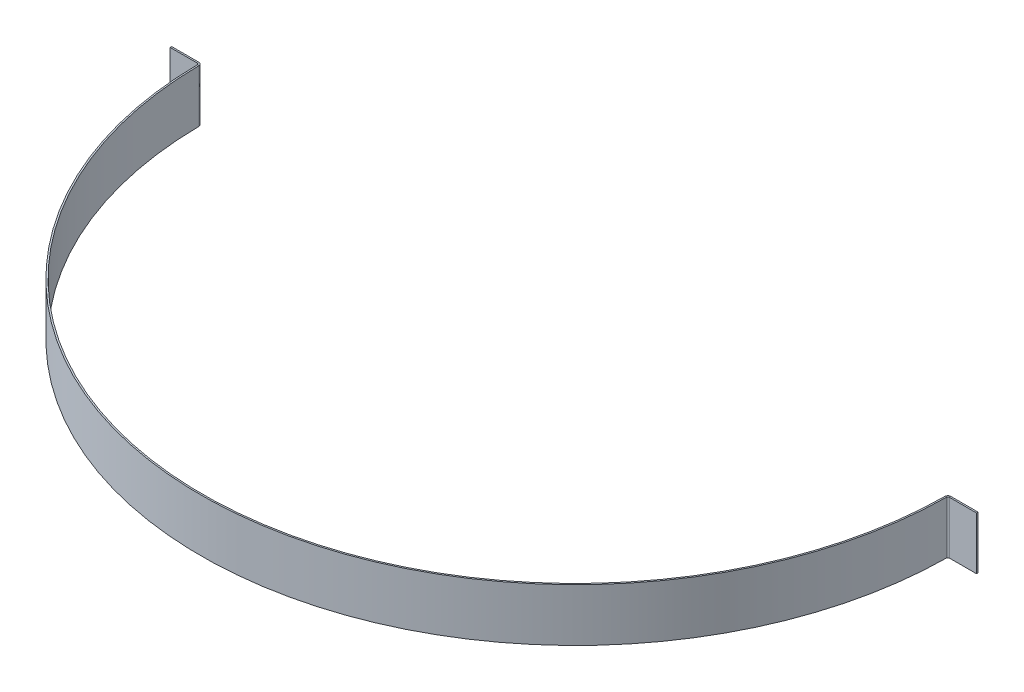
ISO-10303-21;
HEADER;
FILE_DESCRIPTION(('STEP AP214'),'2;1');
FILE_NAME('part.step','',(''),(''),'','','');
FILE_SCHEMA(('AUTOMOTIVE_DESIGN { 1 0 10303 214 1 1 1 1 }'));
ENDSEC;
DATA;
#1=APPLICATION_CONTEXT('core data for automotive mechanical design processes');
#2=APPLICATION_PROTOCOL_DEFINITION('international standard','automotive_design',2000,#1);
#3=PRODUCT_CONTEXT('',#1,'mechanical');
#4=PRODUCT('Part','Part','',(#3));
#5=PRODUCT_RELATED_PRODUCT_CATEGORY('part','',(#4));
#6=PRODUCT_DEFINITION_FORMATION('','',#4);
#7=PRODUCT_DEFINITION_CONTEXT('part definition',#1,'design');
#8=PRODUCT_DEFINITION('design','',#6,#7);
#9=PRODUCT_DEFINITION_SHAPE('','',#8);
#10=(LENGTH_UNIT() NAMED_UNIT(*) SI_UNIT(.MILLI.,.METRE.));
#11=(NAMED_UNIT(*) PLANE_ANGLE_UNIT() SI_UNIT($,.RADIAN.));
#12=(NAMED_UNIT(*) SI_UNIT($,.STERADIAN.) SOLID_ANGLE_UNIT());
#13=UNCERTAINTY_MEASURE_WITH_UNIT(LENGTH_MEASURE(1.E-05),#10,'distance_accuracy_value','');
#14=(GEOMETRIC_REPRESENTATION_CONTEXT(3) GLOBAL_UNCERTAINTY_ASSIGNED_CONTEXT((#13)) GLOBAL_UNIT_ASSIGNED_CONTEXT((#10,
#11,#12)) REPRESENTATION_CONTEXT('',''));
#15=CARTESIAN_POINT('',(0.,0.,0.));
#16=DIRECTION('',(0.,0.,1.));
#17=DIRECTION('',(1.,0.,0.));
#18=AXIS2_PLACEMENT_3D('',#15,#16,#17);
#19=CARTESIAN_POINT('',(-1.33226762955019E-12,140.,-4.44089209850063E-13));
#20=DIRECTION('',(0.,-1.,0.));
#21=DIRECTION('',(-0.999949948709909,0.,-0.010005002501251));
#22=AXIS2_PLACEMENT_3D('',#19,#20,#21);
#23=PLANE('',#22);
#24=DIRECTION('',(-0.99994994870991,0.,0.0100050025011472));
#25=VECTOR('',#24,1.);
#26=CARTESIAN_POINT('',(-991.450374145877,140.,9.91995997998818));
#27=LINE('',#26,#25);
#28=CARTESIAN_POINT('',(-991.450374145877,140.,9.91995997998818));
#29=VERTEX_POINT('',#28);
#30=CARTESIAN_POINT('',(-995.450173940718,140.,9.95997998998977));
#31=VERTEX_POINT('',#30);
#32=EDGE_CURVE('E11',#29,#31,#27,.T.);
#33=ORIENTED_EDGE('',*,*,#32,.T.);
#34=CARTESIAN_POINT('',(-1.33226762955019E-12,140.,-4.44089209850063E-13));
#35=DIRECTION('',(0.,1.,0.));
#36=DIRECTION('',(0.999949948709909,0.,0.010005002501251));
#37=AXIS2_PLACEMENT_3D('',#34,#35,#36);
#38=CIRCLE('',#37,995.5);
#39=CARTESIAN_POINT('',(995.450173940715,140.,9.9599799899957));
#40=VERTEX_POINT('',#39);
#41=EDGE_CURVE('E189',#31,#40,#38,.T.);
#42=ORIENTED_EDGE('',*,*,#41,.T.);
#43=DIRECTION('',(-0.999949948709909,0.,-0.0100050025012509));
#44=VECTOR('',#43,1.);
#45=CARTESIAN_POINT('',(995.450173940713,140.,9.95997998999354));
#46=LINE('',#45,#44);
#47=CARTESIAN_POINT('',(991.450374145875,140.,9.91995997999251));
#48=VERTEX_POINT('',#47);
#49=EDGE_CURVE('E232',#40,#48,#46,.T.);
#50=ORIENTED_EDGE('',*,*,#49,.T.);
#51=CARTESIAN_POINT('',(-1.33226762955019E-12,140.,-4.44089209850063E-13));
#52=DIRECTION('',(0.,1.,0.));
#53=DIRECTION('',(0.999949948709909,0.,0.010005002501251));
#54=AXIS2_PLACEMENT_3D('',#51,#52,#53);
#55=CIRCLE('',#54,991.5);
#56=EDGE_CURVE('E218',#29,#48,#55,.T.);
#57=ORIENTED_EDGE('',*,*,#56,.F.);
#58=EDGE_LOOP('',(#33,#42,#50,#57));
#59=FACE_BOUND('',#58,.T.);
#60=ADVANCED_FACE('F36',(#59),#23,.F.);
#61=CARTESIAN_POINT('',(-1.33226762955019E-12,0.,-4.44089209850063E-13));
#62=DIRECTION('',(0.,1.,0.));
#63=DIRECTION('',(0.999949948709909,0.,0.010005002501251));
#64=AXIS2_PLACEMENT_3D('',#61,#62,#63);
#65=PLANE('',#64);
#66=DIRECTION('',(0.999949948709909,0.,0.0100050025012509));
#67=VECTOR('',#66,1.);
#68=CARTESIAN_POINT('',(991.450374145874,0.,9.91995997998851));
#69=LINE('',#68,#67);
#70=CARTESIAN_POINT('',(991.450374145875,0.,9.91995997999007));
#71=VERTEX_POINT('',#70);
#72=CARTESIAN_POINT('',(995.450173940713,0.,9.95997998999354));
#73=VERTEX_POINT('',#72);
#74=EDGE_CURVE('E236',#71,#73,#69,.T.);
#75=ORIENTED_EDGE('',*,*,#74,.T.);
#76=CARTESIAN_POINT('',(-1.33226762955019E-12,0.,-4.44089209850063E-13));
#77=DIRECTION('',(0.,1.,0.));
#78=DIRECTION('',(0.999949948709909,0.,0.010005002501251));
#79=AXIS2_PLACEMENT_3D('',#76,#77,#78);
#80=CIRCLE('',#79,995.5);
#81=CARTESIAN_POINT('',(-995.450173940717,0.,9.95997998999345));
#82=VERTEX_POINT('',#81);
#83=EDGE_CURVE('E222',#73,#82,#80,.F.);
#84=ORIENTED_EDGE('',*,*,#83,.T.);
#85=DIRECTION('',(0.99994994870991,0.,-0.0100050025011472));
#86=VECTOR('',#85,1.);
#87=CARTESIAN_POINT('',(-995.450173940717,0.,9.95997998999243));
#88=LINE('',#87,#86);
#89=CARTESIAN_POINT('',(-991.450374145877,0.,9.91995997998924));
#90=VERTEX_POINT('',#89);
#91=EDGE_CURVE('E241',#82,#90,#88,.T.);
#92=ORIENTED_EDGE('',*,*,#91,.T.);
#93=CARTESIAN_POINT('',(-1.33226762955019E-12,0.,-4.44089209850063E-13));
#94=DIRECTION('',(0.,-1.,0.));
#95=DIRECTION('',(-0.999949948709909,0.,-0.010005002501251));
#96=AXIS2_PLACEMENT_3D('',#93,#94,#95);
#97=CIRCLE('',#96,991.5);
#98=EDGE_CURVE('E221',#71,#90,#97,.T.);
#99=ORIENTED_EDGE('',*,*,#98,.F.);
#100=EDGE_LOOP('',(#75,#84,#92,#99));
#101=FACE_BOUND('',#100,.T.);
#102=ADVANCED_FACE('F253',(#101),#65,.F.);
#103=CARTESIAN_POINT('',(-1.33226762955019E-12,-3031.62520563376,-4.44089209850063E-13));
#104=DIRECTION('',(0.,1.,0.));
#105=DIRECTION('',(0.999949948709909,0.,0.010005002501251));
#106=AXIS2_PLACEMENT_3D('',#103,#104,#105);
#107=CYLINDRICAL_SURFACE('',#106,991.5);
#108=ORIENTED_EDGE('',*,*,#98,.T.);
#109=DIRECTION('',(0.,-1.,0.));
#110=VECTOR('',#109,1.);
#111=CARTESIAN_POINT('',(-991.450374145877,140.,9.91995997998818));
#112=LINE('',#111,#110);
#113=EDGE_CURVE('E239',#29,#90,#112,.T.);
#114=ORIENTED_EDGE('',*,*,#113,.F.);
#115=ORIENTED_EDGE('',*,*,#56,.T.);
#116=DIRECTION('',(0.,-1.,0.));
#117=VECTOR('',#116,1.);
#118=CARTESIAN_POINT('',(991.450374145874,140.,9.91995997998851));
#119=LINE('',#118,#117);
#120=EDGE_CURVE('E225',#48,#71,#119,.T.);
#121=ORIENTED_EDGE('',*,*,#120,.T.);
#122=EDGE_LOOP('',(#108,#114,#115,#121));
#123=FACE_BOUND('',#122,.T.);
#124=ADVANCED_FACE('F264',(#123),#107,.F.);
#125=CARTESIAN_POINT('',(-1.33226762955019E-12,-3031.62520563376,-4.44089209850063E-13));
#126=DIRECTION('',(0.,1.,0.));
#127=DIRECTION('',(0.999949948709909,0.,0.010005002501251));
#128=AXIS2_PLACEMENT_3D('',#125,#126,#127);
#129=CYLINDRICAL_SURFACE('',#128,995.5);
#130=ORIENTED_EDGE('',*,*,#83,.F.);
#131=DIRECTION('',(0.,-1.,0.));
#132=VECTOR('',#131,1.);
#133=CARTESIAN_POINT('',(995.450173940713,140.,9.95997998999354));
#134=LINE('',#133,#132);
#135=EDGE_CURVE('E58',#40,#73,#134,.T.);
#136=ORIENTED_EDGE('',*,*,#135,.F.);
#137=ORIENTED_EDGE('',*,*,#41,.F.);
#138=DIRECTION('',(0.,-1.,0.));
#139=VECTOR('',#138,1.);
#140=CARTESIAN_POINT('',(-995.450173940717,140.,9.95997998999243));
#141=LINE('',#140,#139);
#142=EDGE_CURVE('E43',#31,#82,#141,.T.);
#143=ORIENTED_EDGE('',*,*,#142,.T.);
#144=EDGE_LOOP('',(#130,#136,#137,#143));
#145=FACE_BOUND('',#144,.T.);
#146=ADVANCED_FACE('F247',(#145),#129,.T.);
#147=CARTESIAN_POINT('',(1071.5,140.,2.));
#148=DIRECTION('',(1.,0.,0.));
#149=DIRECTION('',(0.,0.,-1.));
#150=AXIS2_PLACEMENT_3D('',#147,#148,#149);
#151=PLANE('',#150);
#152=DIRECTION('',(0.,0.,1.));
#153=VECTOR('',#152,1.);
#154=CARTESIAN_POINT('',(1071.5,0.,2.));
#155=LINE('',#154,#153);
#156=CARTESIAN_POINT('',(1071.5,0.,2.));
#157=VERTEX_POINT('',#156);
#158=CARTESIAN_POINT('',(1071.5,0.,6.));
#159=VERTEX_POINT('',#158);
#160=EDGE_CURVE('E186',#157,#159,#155,.T.);
#161=ORIENTED_EDGE('',*,*,#160,.F.);
#162=DIRECTION('',(0.,-1.,0.));
#163=VECTOR('',#162,1.);
#164=CARTESIAN_POINT('',(1071.5,140.,2.));
#165=LINE('',#164,#163);
#166=CARTESIAN_POINT('',(1071.5,140.,2.));
#167=VERTEX_POINT('',#166);
#168=EDGE_CURVE('E207',#167,#157,#165,.T.);
#169=ORIENTED_EDGE('',*,*,#168,.F.);
#170=DIRECTION('',(0.,0.,1.));
#171=VECTOR('',#170,1.);
#172=CARTESIAN_POINT('',(1071.5,140.,2.));
#173=LINE('',#172,#171);
#174=CARTESIAN_POINT('',(1071.5,140.,6.));
#175=VERTEX_POINT('',#174);
#176=EDGE_CURVE('E214',#167,#175,#173,.T.);
#177=ORIENTED_EDGE('',*,*,#176,.T.);
#178=DIRECTION('',(0.,-1.,0.));
#179=VECTOR('',#178,1.);
#180=CARTESIAN_POINT('',(1071.5,140.,6.));
#181=LINE('',#180,#179);
#182=EDGE_CURVE('E212',#175,#159,#181,.T.);
#183=ORIENTED_EDGE('',*,*,#182,.T.);
#184=EDGE_LOOP('',(#161,#169,#177,#183));
#185=FACE_BOUND('',#184,.T.);
#186=ADVANCED_FACE('F287',(#185),#151,.T.);
#187=CARTESIAN_POINT('',(991.497982852209,140.,2.00000000000012));
#188=DIRECTION('',(0.,0.,-1.));
#189=DIRECTION('',(-1.,0.,0.));
#190=AXIS2_PLACEMENT_3D('',#187,#188,#189);
#191=PLANE('',#190);
#192=DIRECTION('',(1.,0.,0.));
#193=VECTOR('',#192,1.);
#194=CARTESIAN_POINT('',(991.497982852209,0.,2.00000000000012));
#195=LINE('',#194,#193);
#196=CARTESIAN_POINT('',(999.449973735554,0.,2.00000000000011));
#197=VERTEX_POINT('',#196);
#198=EDGE_CURVE('E190',#197,#157,#195,.T.);
#199=ORIENTED_EDGE('',*,*,#198,.F.);
#200=DIRECTION('',(0.,-1.,0.));
#201=VECTOR('',#200,1.);
#202=CARTESIAN_POINT('',(999.449973735554,140.,2.00000000000011));
#203=LINE('',#202,#201);
#204=CARTESIAN_POINT('',(999.449973735554,140.,2.00000000000009));
#205=VERTEX_POINT('',#204);
#206=EDGE_CURVE('E183',#205,#197,#203,.T.);
#207=ORIENTED_EDGE('',*,*,#206,.F.);
#208=DIRECTION('',(1.,0.,0.));
#209=VECTOR('',#208,1.);
#210=CARTESIAN_POINT('',(991.497982852209,140.,2.00000000000012));
#211=LINE('',#210,#209);
#212=EDGE_CURVE('E209',#205,#167,#211,.T.);
#213=ORIENTED_EDGE('',*,*,#212,.T.);
#214=ORIENTED_EDGE('',*,*,#168,.T.);
#215=EDGE_LOOP('',(#199,#207,#213,#214));
#216=FACE_BOUND('',#215,.T.);
#217=ADVANCED_FACE('F282',(#216),#191,.T.);
#218=CARTESIAN_POINT('',(995.450173940715,140.,9.95997998999511));
#219=DIRECTION('',(0.,1.,0.));
#220=DIRECTION('',(0.,0.,1.));
#221=AXIS2_PLACEMENT_3D('',#218,#219,#220);
#222=PLANE('',#221);
#223=ORIENTED_EDGE('',*,*,#212,.F.);
#224=DIRECTION('',(0.,0.,1.));
#225=VECTOR('',#224,1.);
#226=CARTESIAN_POINT('',(999.449973735554,140.,2.00000000000011));
#227=LINE('',#226,#225);
#228=CARTESIAN_POINT('',(999.449973735554,140.,6.00000000000011));
#229=VERTEX_POINT('',#228);
#230=EDGE_CURVE('E204',#205,#229,#227,.T.);
#231=ORIENTED_EDGE('',*,*,#230,.T.);
#232=DIRECTION('',(1.,0.,0.));
#233=VECTOR('',#232,1.);
#234=CARTESIAN_POINT('',(991.497982852209,140.,6.00000000000012));
#235=LINE('',#234,#233);
#236=EDGE_CURVE('E202',#229,#175,#235,.T.);
#237=ORIENTED_EDGE('',*,*,#236,.T.);
#238=ORIENTED_EDGE('',*,*,#176,.F.);
#239=EDGE_LOOP('',(#223,#231,#237,#238));
#240=FACE_BOUND('',#239,.T.);
#241=ADVANCED_FACE('F280',(#240),#222,.T.);
#242=CARTESIAN_POINT('',(991.497982852209,140.,6.00000000000012));
#243=DIRECTION('',(0.,0.,-1.));
#244=DIRECTION('',(-1.,0.,0.));
#245=AXIS2_PLACEMENT_3D('',#242,#243,#244);
#246=PLANE('',#245);
#247=DIRECTION('',(1.,0.,0.));
#248=VECTOR('',#247,1.);
#249=CARTESIAN_POINT('',(991.497982852209,0.,6.00000000000012));
#250=LINE('',#249,#248);
#251=CARTESIAN_POINT('',(999.449973735554,0.,6.00000000000011));
#252=VERTEX_POINT('',#251);
#253=EDGE_CURVE('E199',#252,#159,#250,.T.);
#254=ORIENTED_EDGE('',*,*,#253,.T.);
#255=ORIENTED_EDGE('',*,*,#182,.F.);
#256=ORIENTED_EDGE('',*,*,#236,.F.);
#257=DIRECTION('',(0.,-1.,0.));
#258=VECTOR('',#257,1.);
#259=CARTESIAN_POINT('',(999.449973735554,140.,6.00000000000011));
#260=LINE('',#259,#258);
#261=EDGE_CURVE('E196',#229,#252,#260,.T.);
#262=ORIENTED_EDGE('',*,*,#261,.T.);
#263=EDGE_LOOP('',(#254,#255,#256,#262));
#264=FACE_BOUND('',#263,.T.);
#265=ADVANCED_FACE('F276',(#264),#246,.F.);
#266=CARTESIAN_POINT('',(999.449973735554,0.,10.0000000000001));
#267=DIRECTION('',(0.,1.,0.));
#268=DIRECTION('',(1.,0.,0.));
#269=AXIS2_PLACEMENT_3D('',#266,#267,#268);
#270=PLANE('',#269);
#271=ORIENTED_EDGE('',*,*,#253,.F.);
#272=DIRECTION('',(0.,0.,-1.));
#273=VECTOR('',#272,1.);
#274=CARTESIAN_POINT('',(999.449973735554,0.,6.00000000000011));
#275=LINE('',#274,#273);
#276=EDGE_CURVE('E193',#252,#197,#275,.T.);
#277=ORIENTED_EDGE('',*,*,#276,.T.);
#278=ORIENTED_EDGE('',*,*,#198,.T.);
#279=ORIENTED_EDGE('',*,*,#160,.T.);
#280=EDGE_LOOP('',(#271,#277,#278,#279));
#281=FACE_BOUND('',#280,.T.);
#282=ADVANCED_FACE('F285',(#281),#270,.F.);
#283=CARTESIAN_POINT('',(999.449973735554,140.,10.0000000000001));
#284=DIRECTION('',(0.,1.,0.));
#285=DIRECTION('',(0.,0.,1.));
#286=AXIS2_PLACEMENT_3D('',#283,#284,#285);
#287=PLANE('',#286);
#288=ORIENTED_EDGE('',*,*,#49,.F.);
#289=CARTESIAN_POINT('',(999.449973735554,140.,10.0000000000001));
#290=DIRECTION('',(0.,1.,0.));
#291=DIRECTION('',(0.,0.,1.));
#292=AXIS2_PLACEMENT_3D('',#289,#290,#291);
#293=CIRCLE('',#292,4.);
#294=EDGE_CURVE('E172',#40,#229,#293,.F.);
#295=ORIENTED_EDGE('',*,*,#294,.T.);
#296=ORIENTED_EDGE('',*,*,#230,.F.);
#297=CARTESIAN_POINT('',(999.449973735554,140.,10.0000000000001));
#298=DIRECTION('',(0.,-1.,0.));
#299=DIRECTION('',(0.,0.,-1.));
#300=AXIS2_PLACEMENT_3D('',#297,#298,#299);
#301=CIRCLE('',#300,8.00000000000002);
#302=EDGE_CURVE('E176',#48,#205,#301,.T.);
#303=ORIENTED_EDGE('',*,*,#302,.F.);
#304=EDGE_LOOP('',(#288,#295,#296,#303));
#305=FACE_BOUND('',#304,.T.);
#306=ADVANCED_FACE('F269',(#305),#287,.T.);
#307=CARTESIAN_POINT('',(999.449973735554,0.,10.0000000000001));
#308=DIRECTION('',(0.,-1.,0.));
#309=DIRECTION('',(0.,0.,-1.));
#310=AXIS2_PLACEMENT_3D('',#307,#308,#309);
#311=PLANE('',#310);
#312=ORIENTED_EDGE('',*,*,#276,.F.);
#313=CARTESIAN_POINT('',(999.449973735554,0.,10.0000000000001));
#314=DIRECTION('',(0.,1.,0.));
#315=DIRECTION('',(0.,0.,1.));
#316=AXIS2_PLACEMENT_3D('',#313,#314,#315);
#317=CIRCLE('',#316,4.);
#318=EDGE_CURVE('E180',#252,#73,#317,.T.);
#319=ORIENTED_EDGE('',*,*,#318,.T.);
#320=ORIENTED_EDGE('',*,*,#74,.F.);
#321=CARTESIAN_POINT('',(999.449973735554,0.,10.0000000000001));
#322=DIRECTION('',(0.,1.,0.));
#323=DIRECTION('',(0.,0.,1.));
#324=AXIS2_PLACEMENT_3D('',#321,#322,#323);
#325=CIRCLE('',#324,7.99999999999997);
#326=EDGE_CURVE('E179',#197,#71,#325,.T.);
#327=ORIENTED_EDGE('',*,*,#326,.F.);
#328=EDGE_LOOP('',(#312,#319,#320,#327));
#329=FACE_BOUND('',#328,.T.);
#330=ADVANCED_FACE('F257',(#329),#311,.T.);
#331=CARTESIAN_POINT('',(999.449973735554,-70.2825481039813,10.0000000000001));
#332=DIRECTION('',(0.,1.,0.));
#333=DIRECTION('',(0.,0.,1.));
#334=AXIS2_PLACEMENT_3D('',#331,#332,#333);
#335=CYLINDRICAL_SURFACE('',#334,8.);
#336=ORIENTED_EDGE('',*,*,#326,.T.);
#337=ORIENTED_EDGE('',*,*,#120,.F.);
#338=ORIENTED_EDGE('',*,*,#302,.T.);
#339=ORIENTED_EDGE('',*,*,#206,.T.);
#340=EDGE_LOOP('',(#336,#337,#338,#339));
#341=FACE_BOUND('',#340,.T.);
#342=ADVANCED_FACE('F261',(#341),#335,.T.);
#343=CARTESIAN_POINT('',(999.449973735554,-70.2825481039813,10.0000000000001));
#344=DIRECTION('',(0.,1.,0.));
#345=DIRECTION('',(0.,0.,1.));
#346=AXIS2_PLACEMENT_3D('',#343,#344,#345);
#347=CYLINDRICAL_SURFACE('',#346,4.);
#348=ORIENTED_EDGE('',*,*,#318,.F.);
#349=ORIENTED_EDGE('',*,*,#261,.F.);
#350=ORIENTED_EDGE('',*,*,#294,.F.);
#351=ORIENTED_EDGE('',*,*,#135,.T.);
#352=EDGE_LOOP('',(#348,#349,#350,#351));
#353=FACE_BOUND('',#352,.T.);
#354=ADVANCED_FACE('F271',(#353),#347,.F.);
#355=CARTESIAN_POINT('',(-999.449973735557,140.,9.99999999999818));
#356=DIRECTION('',(0.,1.,0.));
#357=DIRECTION('',(0.,0.,1.));
#358=AXIS2_PLACEMENT_3D('',#355,#356,#357);
#359=PLANE('',#358);
#360=DIRECTION('',(0.,0.,-1.));
#361=VECTOR('',#360,1.);
#362=CARTESIAN_POINT('',(-999.449973735556,140.,5.99999999999745));
#363=LINE('',#362,#361);
#364=CARTESIAN_POINT('',(-999.449973735556,140.,5.99999999999745));
#365=VERTEX_POINT('',#364);
#366=CARTESIAN_POINT('',(-999.449973735556,140.,1.999999999998));
#367=VERTEX_POINT('',#366);
#368=EDGE_CURVE('E175',#365,#367,#363,.T.);
#369=ORIENTED_EDGE('',*,*,#368,.F.);
#370=CARTESIAN_POINT('',(-999.449973735557,140.,9.99999999999818));
#371=DIRECTION('',(0.,1.,0.));
#372=DIRECTION('',(0.,0.,1.));
#373=AXIS2_PLACEMENT_3D('',#370,#371,#372);
#374=CIRCLE('',#373,4.);
#375=EDGE_CURVE('E50',#365,#31,#374,.F.);
#376=ORIENTED_EDGE('',*,*,#375,.T.);
#377=ORIENTED_EDGE('',*,*,#32,.F.);
#378=CARTESIAN_POINT('',(-999.449973735557,140.,9.99999999999818));
#379=DIRECTION('',(0.,-1.,0.));
#380=DIRECTION('',(0.,0.,-1.));
#381=AXIS2_PLACEMENT_3D('',#378,#379,#380);
#382=CIRCLE('',#381,8.00000000000003);
#383=EDGE_CURVE('E165',#367,#29,#382,.T.);
#384=ORIENTED_EDGE('',*,*,#383,.F.);
#385=EDGE_LOOP('',(#369,#376,#377,#384));
#386=FACE_BOUND('',#385,.T.);
#387=ADVANCED_FACE('F346',(#386),#359,.T.);
#388=CARTESIAN_POINT('',(-999.449973735557,0.,9.99999999999818));
#389=DIRECTION('',(0.,-1.,0.));
#390=DIRECTION('',(0.,0.,-1.));
#391=AXIS2_PLACEMENT_3D('',#388,#389,#390);
#392=PLANE('',#391);
#393=ORIENTED_EDGE('',*,*,#91,.F.);
#394=CARTESIAN_POINT('',(-999.449973735557,0.,9.99999999999818));
#395=DIRECTION('',(0.,1.,0.));
#396=DIRECTION('',(0.,0.,1.));
#397=AXIS2_PLACEMENT_3D('',#394,#395,#396);
#398=CIRCLE('',#397,4.);
#399=CARTESIAN_POINT('',(-999.449973735556,0.,5.99999999999745));
#400=VERTEX_POINT('',#399);
#401=EDGE_CURVE('E169',#82,#400,#398,.T.);
#402=ORIENTED_EDGE('',*,*,#401,.T.);
#403=DIRECTION('',(0.,0.,1.));
#404=VECTOR('',#403,1.);
#405=CARTESIAN_POINT('',(-999.449973735556,0.,1.999999999998));
#406=LINE('',#405,#404);
#407=CARTESIAN_POINT('',(-999.449973735557,0.,1.99999999999816));
#408=VERTEX_POINT('',#407);
#409=EDGE_CURVE('E143',#408,#400,#406,.T.);
#410=ORIENTED_EDGE('',*,*,#409,.F.);
#411=CARTESIAN_POINT('',(-999.449973735557,0.,9.99999999999818));
#412=DIRECTION('',(0.,1.,0.));
#413=DIRECTION('',(0.,0.,1.));
#414=AXIS2_PLACEMENT_3D('',#411,#412,#413);
#415=CIRCLE('',#414,8.00000000000002);
#416=EDGE_CURVE('E168',#90,#408,#415,.T.);
#417=ORIENTED_EDGE('',*,*,#416,.F.);
#418=EDGE_LOOP('',(#393,#402,#410,#417));
#419=FACE_BOUND('',#418,.T.);
#420=ADVANCED_FACE('F353',(#419),#392,.T.);
#421=CARTESIAN_POINT('',(-999.449973735557,-70.2870834487937,9.99999999999818));
#422=DIRECTION('',(0.,1.,0.));
#423=DIRECTION('',(0.,0.,1.));
#424=AXIS2_PLACEMENT_3D('',#421,#422,#423);
#425=CYLINDRICAL_SURFACE('',#424,8.);
#426=ORIENTED_EDGE('',*,*,#416,.T.);
#427=DIRECTION('',(0.,-1.,0.));
#428=VECTOR('',#427,1.);
#429=CARTESIAN_POINT('',(-999.449973735556,140.,1.999999999998));
#430=LINE('',#429,#428);
#431=EDGE_CURVE('E154',#367,#408,#430,.T.);
#432=ORIENTED_EDGE('',*,*,#431,.F.);
#433=ORIENTED_EDGE('',*,*,#383,.T.);
#434=ORIENTED_EDGE('',*,*,#113,.T.);
#435=EDGE_LOOP('',(#426,#432,#433,#434));
#436=FACE_BOUND('',#435,.T.);
#437=ADVANCED_FACE('F360',(#436),#425,.T.);
#438=CARTESIAN_POINT('',(-999.449973735557,-70.2870834487937,9.99999999999818));
#439=DIRECTION('',(0.,1.,0.));
#440=DIRECTION('',(0.,0.,1.));
#441=AXIS2_PLACEMENT_3D('',#438,#439,#440);
#442=CYLINDRICAL_SURFACE('',#441,4.);
#443=ORIENTED_EDGE('',*,*,#401,.F.);
#444=ORIENTED_EDGE('',*,*,#142,.F.);
#445=ORIENTED_EDGE('',*,*,#375,.F.);
#446=DIRECTION('',(0.,-1.,0.));
#447=VECTOR('',#446,1.);
#448=CARTESIAN_POINT('',(-999.449973735556,140.,5.99999999999745));
#449=LINE('',#448,#447);
#450=EDGE_CURVE('E162',#365,#400,#449,.T.);
#451=ORIENTED_EDGE('',*,*,#450,.T.);
#452=EDGE_LOOP('',(#443,#444,#445,#451));
#453=FACE_BOUND('',#452,.T.);
#454=ADVANCED_FACE('F250',(#453),#442,.F.);
#455=CARTESIAN_POINT('',(-1071.5,140.,5.99999999999767));
#456=DIRECTION('',(-1.,0.,0.));
#457=DIRECTION('',(0.,0.,1.));
#458=AXIS2_PLACEMENT_3D('',#455,#456,#457);
#459=PLANE('',#458);
#460=DIRECTION('',(0.,0.,-1.));
#461=VECTOR('',#460,1.);
#462=CARTESIAN_POINT('',(-1071.5,0.,5.99999999999767));
#463=LINE('',#462,#461);
#464=CARTESIAN_POINT('',(-1071.5,0.,5.99999999999767));
#465=VERTEX_POINT('',#464);
#466=CARTESIAN_POINT('',(-1071.5,0.,1.999999999997));
#467=VERTEX_POINT('',#466);
#468=EDGE_CURVE('E141',#465,#467,#463,.T.);
#469=ORIENTED_EDGE('',*,*,#468,.F.);
#470=DIRECTION('',(0.,-1.,0.));
#471=VECTOR('',#470,1.);
#472=CARTESIAN_POINT('',(-1071.5,140.,5.99999999999767));
#473=LINE('',#472,#471);
#474=CARTESIAN_POINT('',(-1071.5,140.,5.99999999999767));
#475=VERTEX_POINT('',#474);
#476=EDGE_CURVE('E126',#475,#465,#473,.T.);
#477=ORIENTED_EDGE('',*,*,#476,.F.);
#478=DIRECTION('',(0.,0.,-1.));
#479=VECTOR('',#478,1.);
#480=CARTESIAN_POINT('',(-1071.5,140.,5.99999999999767));
#481=LINE('',#480,#479);
#482=CARTESIAN_POINT('',(-1071.5,140.,1.999999999997));
#483=VERTEX_POINT('',#482);
#484=EDGE_CURVE('E160',#475,#483,#481,.T.);
#485=ORIENTED_EDGE('',*,*,#484,.T.);
#486=DIRECTION('',(0.,-1.,0.));
#487=VECTOR('',#486,1.);
#488=CARTESIAN_POINT('',(-1071.5,140.,1.999999999997));
#489=LINE('',#488,#487);
#490=EDGE_CURVE('E147',#483,#467,#489,.T.);
#491=ORIENTED_EDGE('',*,*,#490,.T.);
#492=EDGE_LOOP('',(#469,#477,#485,#491));
#493=FACE_BOUND('',#492,.T.);
#494=ADVANCED_FACE('F146',(#493),#459,.T.);
#495=CARTESIAN_POINT('',(-991.497982852212,140.,1.99999999999734));
#496=DIRECTION('',(0.,0.,-1.));
#497=DIRECTION('',(-1.,0.,0.));
#498=AXIS2_PLACEMENT_3D('',#495,#496,#497);
#499=PLANE('',#498);
#500=DIRECTION('',(1.,0.,0.));
#501=VECTOR('',#500,1.);
#502=CARTESIAN_POINT('',(-991.497982852212,0.,1.99999999999734));
#503=LINE('',#502,#501);
#504=EDGE_CURVE('E150',#467,#408,#503,.T.);
#505=ORIENTED_EDGE('',*,*,#504,.F.);
#506=ORIENTED_EDGE('',*,*,#490,.F.);
#507=DIRECTION('',(1.,0.,0.));
#508=VECTOR('',#507,1.);
#509=CARTESIAN_POINT('',(-991.497982852212,140.,1.99999999999734));
#510=LINE('',#509,#508);
#511=EDGE_CURVE('E157',#483,#367,#510,.T.);
#512=ORIENTED_EDGE('',*,*,#511,.T.);
#513=ORIENTED_EDGE('',*,*,#431,.T.);
#514=EDGE_LOOP('',(#505,#506,#512,#513));
#515=FACE_BOUND('',#514,.T.);
#516=ADVANCED_FACE('F380',(#515),#499,.T.);
#517=CARTESIAN_POINT('',(-995.450173940717,0.,9.95997998999199));
#518=DIRECTION('',(0.,-1.,0.));
#519=DIRECTION('',(0.,0.,-1.));
#520=AXIS2_PLACEMENT_3D('',#517,#518,#519);
#521=PLANE('',#520);
#522=ORIENTED_EDGE('',*,*,#504,.T.);
#523=ORIENTED_EDGE('',*,*,#409,.T.);
#524=DIRECTION('',(1.,0.,0.));
#525=VECTOR('',#524,1.);
#526=CARTESIAN_POINT('',(-991.497982852211,0.,5.99999999999801));
#527=LINE('',#526,#525);
#528=EDGE_CURVE('E130',#465,#400,#527,.T.);
#529=ORIENTED_EDGE('',*,*,#528,.F.);
#530=ORIENTED_EDGE('',*,*,#468,.T.);
#531=EDGE_LOOP('',(#522,#523,#529,#530));
#532=FACE_BOUND('',#531,.T.);
#533=ADVANCED_FACE('F140',(#532),#521,.T.);
#534=CARTESIAN_POINT('',(-991.497982852211,140.,5.99999999999801));
#535=DIRECTION('',(0.,0.,-1.));
#536=DIRECTION('',(-1.,0.,0.));
#537=AXIS2_PLACEMENT_3D('',#534,#535,#536);
#538=PLANE('',#537);
#539=ORIENTED_EDGE('',*,*,#528,.T.);
#540=ORIENTED_EDGE('',*,*,#450,.F.);
#541=DIRECTION('',(1.,0.,0.));
#542=VECTOR('',#541,1.);
#543=CARTESIAN_POINT('',(-991.497982852211,140.,5.99999999999801));
#544=LINE('',#543,#542);
#545=EDGE_CURVE('E132',#475,#365,#544,.T.);
#546=ORIENTED_EDGE('',*,*,#545,.F.);
#547=ORIENTED_EDGE('',*,*,#476,.T.);
#548=EDGE_LOOP('',(#539,#540,#546,#547));
#549=FACE_BOUND('',#548,.T.);
#550=ADVANCED_FACE('F128',(#549),#538,.F.);
#551=CARTESIAN_POINT('',(999.449973735553,140.,9.99999999999812));
#552=DIRECTION('',(0.,1.,0.));
#553=DIRECTION('',(1.,0.,0.));
#554=AXIS2_PLACEMENT_3D('',#551,#552,#553);
#555=PLANE('',#554);
#556=ORIENTED_EDGE('',*,*,#545,.T.);
#557=ORIENTED_EDGE('',*,*,#368,.T.);
#558=ORIENTED_EDGE('',*,*,#511,.F.);
#559=ORIENTED_EDGE('',*,*,#484,.F.);
#560=EDGE_LOOP('',(#556,#557,#558,#559));
#561=FACE_BOUND('',#560,.T.);
#562=ADVANCED_FACE('F400',(#561),#555,.T.);
#563=CLOSED_SHELL('',(#60,#102,#124,#146,#186,#217,#241,#265,#282,#306,#330,#342,#354,#387,#420,
#437,#454,#494,#516,#533,#550,#562));
#564=MANIFOLD_SOLID_BREP('B2',#563);
#565=ADVANCED_BREP_SHAPE_REPRESENTATION('',(#18,#564),#14);
#566=SHAPE_DEFINITION_REPRESENTATION(#9,#565);
ENDSEC;
END-ISO-10303-21;
